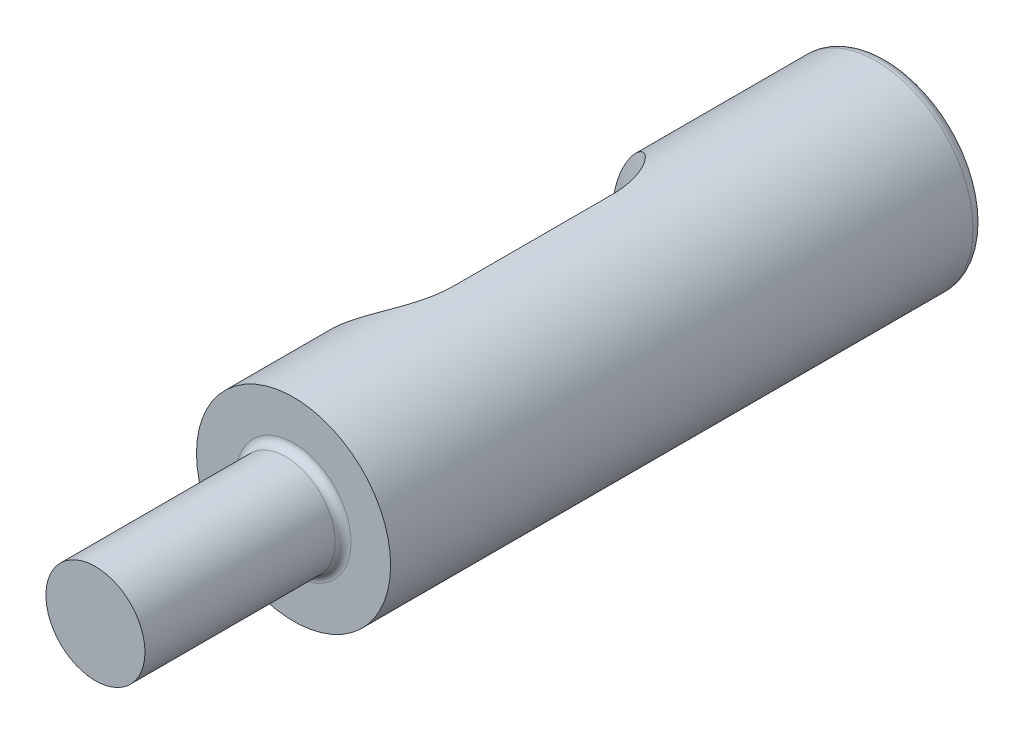
ISO-10303-21;
HEADER;
FILE_DESCRIPTION(('STEP AP214'),'2;1');
FILE_NAME('part.step','',(''),(''),'','','');
FILE_SCHEMA(('AUTOMOTIVE_DESIGN { 1 0 10303 214 1 1 1 1 }'));
ENDSEC;
DATA;
#1=APPLICATION_CONTEXT('core data for automotive mechanical design processes');
#2=APPLICATION_PROTOCOL_DEFINITION('international standard','automotive_design',2000,#1);
#3=PRODUCT_CONTEXT('',#1,'mechanical');
#4=PRODUCT('Part','Part','',(#3));
#5=PRODUCT_RELATED_PRODUCT_CATEGORY('part','',(#4));
#6=PRODUCT_DEFINITION_FORMATION('','',#4);
#7=PRODUCT_DEFINITION_CONTEXT('part definition',#1,'design');
#8=PRODUCT_DEFINITION('design','',#6,#7);
#9=PRODUCT_DEFINITION_SHAPE('','',#8);
#10=(LENGTH_UNIT() NAMED_UNIT(*) SI_UNIT(.MILLI.,.METRE.));
#11=(NAMED_UNIT(*) PLANE_ANGLE_UNIT() SI_UNIT($,.RADIAN.));
#12=(NAMED_UNIT(*) SI_UNIT($,.STERADIAN.) SOLID_ANGLE_UNIT());
#13=UNCERTAINTY_MEASURE_WITH_UNIT(LENGTH_MEASURE(1.E-05),#10,'distance_accuracy_value','');
#14=(GEOMETRIC_REPRESENTATION_CONTEXT(3) GLOBAL_UNCERTAINTY_ASSIGNED_CONTEXT((#13)) GLOBAL_UNIT_ASSIGNED_CONTEXT((#10,
#11,#12)) REPRESENTATION_CONTEXT('',''));
#15=CARTESIAN_POINT('',(0.,0.,0.));
#16=DIRECTION('',(0.,0.,1.));
#17=DIRECTION('',(1.,0.,0.));
#18=AXIS2_PLACEMENT_3D('',#15,#16,#17);
#19=CARTESIAN_POINT('',(0.,0.,15.));
#20=DIRECTION('',(0.,0.,-1.));
#21=DIRECTION('',(-1.,0.,0.));
#22=AXIS2_PLACEMENT_3D('',#19,#20,#21);
#23=CYLINDRICAL_SURFACE('',#22,2.45);
#24=CARTESIAN_POINT('',(0.,0.,0.3));
#25=DIRECTION('',(0.,0.,1.));
#26=DIRECTION('',(1.,0.,0.));
#27=AXIS2_PLACEMENT_3D('',#24,#25,#26);
#28=CIRCLE('',#27,2.45);
#29=CARTESIAN_POINT('',(2.45,0.,0.3));
#30=VERTEX_POINT('',#29);
#31=EDGE_CURVE('E89',#30,#30,#28,.T.);
#32=ORIENTED_EDGE('',*,*,#31,.T.);
#33=EDGE_LOOP('',(#32));
#34=FACE_BOUND('',#33,.T.);
#35=DIRECTION('',(0.,0.,-1.));
#36=VECTOR('',#35,1.);
#37=CARTESIAN_POINT('',(-0.450000000000001,-2.40831891575846,15.));
#38=LINE('',#37,#36);
#39=CARTESIAN_POINT('',(-0.450000000000001,-2.40831891575846,10.5));
#40=VERTEX_POINT('',#39);
#41=CARTESIAN_POINT('',(-0.450000000000001,-2.40831891575846,6.5));
#42=VERTEX_POINT('',#41);
#43=EDGE_CURVE('E68',#40,#42,#38,.T.);
#44=ORIENTED_EDGE('',*,*,#43,.T.);
#45=CARTESIAN_POINT('',(-0.45,-2.40831891575846,6.5));
#46=CARTESIAN_POINT('',(-0.449994588638644,-2.40830673990182,6.44576312548334));
#47=CARTESIAN_POINT('',(-0.452206245268192,-2.4079063220936,6.39152773474038));
#48=CARTESIAN_POINT('',(-0.461022623952719,-2.40624085456906,6.28342465332292));
#49=CARTESIAN_POINT('',(-0.467627668315555,-2.40497574141675,6.22955698991857));
#50=CARTESIAN_POINT('',(-0.485205113353329,-2.4014896622942,6.1224685058545));
#51=CARTESIAN_POINT('',(-0.496185139622994,-2.39926702681005,6.06924898270644));
#52=CARTESIAN_POINT('',(-0.522411179042363,-2.39369255367939,5.96394935087511));
#53=CARTESIAN_POINT('',(-0.537657047458412,-2.39034075434294,5.91186920359915));
#54=CARTESIAN_POINT('',(-0.589676891075349,-2.37825032883879,5.75775371753407));
#55=CARTESIAN_POINT('',(-0.63272426843513,-2.36747797430707,5.65789673021974));
#56=CARTESIAN_POINT('',(-0.733760945904154,-2.33812700415293,5.46746376614885));
#57=CARTESIAN_POINT('',(-0.791732418586446,-2.31955768572881,5.37687689506566));
#58=CARTESIAN_POINT('',(-0.917450163232201,-2.27268604684569,5.21092489353521));
#59=CARTESIAN_POINT('',(-0.984758767234141,-2.24476661182929,5.13512261585109));
#60=CARTESIAN_POINT('',(-1.12677450492275,-2.1769329800425,4.99704661491339));
#61=CARTESIAN_POINT('',(-1.20147705227831,-2.13702618793932,4.93476458091471));
#62=CARTESIAN_POINT('',(-1.34735454603354,-2.04788817506974,4.82917926909461));
#63=CARTESIAN_POINT('',(-1.41833562359118,-1.99965454083784,4.78475846452458));
#64=CARTESIAN_POINT('',(-1.55856870579026,-1.89239384178598,4.70786316333547));
#65=CARTESIAN_POINT('',(-1.62782035056384,-1.83336455148134,4.67539113407729));
#66=CARTESIAN_POINT('',(-1.76215318853848,-1.70472549555496,4.62058113249996));
#67=CARTESIAN_POINT('',(-1.82716389941972,-1.63498134121712,4.59838872569483));
#68=CARTESIAN_POINT('',(-1.949459862911,-1.48705532942486,4.56259762018655));
#69=CARTESIAN_POINT('',(-2.00674134436046,-1.40886938639542,4.54900310463071));
#70=CARTESIAN_POINT('',(-2.11980325298674,-1.23344802850569,4.52647987659713));
#71=CARTESIAN_POINT('',(-2.17407266027131,-1.13511367748442,4.51855552025091));
#72=CARTESIAN_POINT('',(-2.26872434578966,-0.931660324411916,4.50765970477704));
#73=CARTESIAN_POINT('',(-2.30909718120948,-0.826536766429594,4.50469160820744));
#74=CARTESIAN_POINT('',(-2.36124234307436,-0.656743516125686,4.50188094000956));
#75=CARTESIAN_POINT('',(-2.37791431743643,-0.593543316171441,4.50125033937441));
#76=CARTESIAN_POINT('',(-2.40615688679643,-0.466014475964106,4.50042994937348));
#77=CARTESIAN_POINT('',(-2.41772867822465,-0.401686104049764,4.50024005657928));
#78=CARTESIAN_POINT('',(-2.43569945761391,-0.272283726408916,4.50003106998745));
#79=CARTESIAN_POINT('',(-2.44209608193317,-0.207209393726581,4.50001205419403));
#80=CARTESIAN_POINT('',(-2.44966746519406,-0.076778985649605,4.49999642568401));
#81=CARTESIAN_POINT('',(-2.45084392585907,-0.0114230090235922,4.49999980566571));
#82=CARTESIAN_POINT('',(-2.44789577303633,0.122603398217185,4.5000003846436));
#83=CARTESIAN_POINT('',(-2.44348976100511,0.19126779861946,4.49999725000327));
#84=CARTESIAN_POINT('',(-2.42891988046143,0.327985786613469,4.50009790460084));
#85=CARTESIAN_POINT('',(-2.41875570598017,0.396039341551772,4.50020169952083));
#86=CARTESIAN_POINT('',(-2.39273502899384,0.531083578166653,4.50077765617357));
#87=CARTESIAN_POINT('',(-2.37687571208978,0.598073717207834,4.50125000016977));
#88=CARTESIAN_POINT('',(-2.33957154891383,0.730506440396349,4.50296367021533));
#89=CARTESIAN_POINT('',(-2.31812403873948,0.795948270188171,4.504205363405));
#90=CARTESIAN_POINT('',(-2.26979020110749,0.924819851906864,4.50798791132727));
#91=CARTESIAN_POINT('',(-2.2428993195288,0.988247867258108,4.51052985663496));
#92=CARTESIAN_POINT('',(-2.18392196405104,1.1125265907134,4.51755600733056));
#93=CARTESIAN_POINT('',(-2.15183599892548,1.17337755046246,4.52204002259641));
#94=CARTESIAN_POINT('',(-2.08282786305046,1.29190579948356,4.53368211834222));
#95=CARTESIAN_POINT('',(-2.04591245945963,1.34958737211854,4.54083648256819));
#96=CARTESIAN_POINT('',(-1.96768828241532,1.46128599403185,4.55861274135592));
#97=CARTESIAN_POINT('',(-1.92638111511628,1.51530437125597,4.56923337115718));
#98=CARTESIAN_POINT('',(-1.81881968401488,1.64452697674732,4.6010252972687));
#99=CARTESIAN_POINT('',(-1.75022867654072,1.71720495714494,4.62481608420215));
#100=CARTESIAN_POINT('',(-1.60762382396598,1.85138392247269,4.68441419536105));
#101=CARTESIAN_POINT('',(-1.53361551293107,1.91289609630418,4.72020938675206));
#102=CARTESIAN_POINT('',(-1.38386896929108,2.02388996106238,4.80565299161913));
#103=CARTESIAN_POINT('',(-1.30812440080229,2.07331567680056,4.85536365648865));
#104=CARTESIAN_POINT('',(-1.1600344295933,2.15967286454585,4.9687666163425));
#105=CARTESIAN_POINT('',(-1.08768931032844,2.19660329624841,5.03246007474759));
#106=CARTESIAN_POINT('',(-0.955924709780423,2.25689744511659,5.16734198243619));
#107=CARTESIAN_POINT('',(-0.89594591711626,2.28105917616675,5.23763469973116));
#108=CARTESIAN_POINT('',(-0.785462095537206,2.32142570760885,5.3873567483365));
#109=CARTESIAN_POINT('',(-0.734960197119518,2.33762788157415,5.46678908480378));
#110=CARTESIAN_POINT('',(-0.64319011108965,2.36457455526543,5.63674156027941));
#111=CARTESIAN_POINT('',(-0.602484102874423,2.37501845982701,5.72761153903245));
#112=CARTESIAN_POINT('',(-0.534958418315524,2.39113559866541,5.91475772347202));
#113=CARTESIAN_POINT('',(-0.508136461801864,2.39680961639362,6.0110330385626));
#114=CARTESIAN_POINT('',(-0.475789148637746,2.40339230995952,6.17317930955462));
#115=CARTESIAN_POINT('',(-0.466120109198568,2.40526631403476,6.23821815228647));
#116=CARTESIAN_POINT('',(-0.45322792760705,2.40771605705514,6.36883154241866));
#117=CARTESIAN_POINT('',(-0.449992597637919,2.40829425100674,6.43440484017941));
#118=CARTESIAN_POINT('',(-0.45,2.40831891575846,6.5));
#119=B_SPLINE_CURVE_WITH_KNOTS('',3,(#45,#46,#47,#48,#49,#50,#51,#52,#53,#54,#55,#56,#57,#58,
#59,#60,#61,#62,#63,#64,#65,#66,#67,#68,#69,#70,#71,#72,#73,#74,#75,#76,#77,#78,#79,#80,#81,#82,
#83,#84,#85,#86,#87,#88,#89,#90,#91,#92,#93,#94,#95,#96,#97,#98,#99,#100,#101,#102,#103,#104,
#105,#106,#107,#108,#109,#110,#111,#112,#113,#114,#115,#116,#117,#118),.UNSPECIFIED.,.F.,.F.,(4,
2,2,2,2,2,2,2,2,2,2,2,2,2,2,2,2,2,2,2,2,2,2,2,2,2,2,2,2,2,2,2,2,2,2,2,4),(0.,0.162661127417037,
0.32533418930149,0.488292039476625,0.651244361405537,0.97730937274322,1.30298667926192,
1.61669186460785,1.93020366934838,2.21870983734064,2.50727554699138,2.79981120681034,
3.09248908525521,3.42902207777651,3.76578329736792,3.96169601111715,4.15756274204083,
4.35351888029015,4.5494111340192,4.75558229731805,4.96176441686591,5.16804856706681,
5.3744312338066,5.58098728673507,5.78752312309691,5.99377259424879,6.19994689369567,
6.50673942077732,6.81322280291548,7.12109978460593,7.42900239252902,7.71426024038907,
7.99961215207868,8.29871370567918,8.597766122403,8.79479918661163,8.99145864065558),.UNSPECIFIED.);
#120=CARTESIAN_POINT('',(-0.450000000000001,2.40831891575846,6.5));
#121=VERTEX_POINT('',#120);
#122=EDGE_CURVE('E74',#42,#121,#119,.T.);
#123=ORIENTED_EDGE('',*,*,#122,.T.);
#124=DIRECTION('',(0.,0.,-1.));
#125=VECTOR('',#124,1.);
#126=CARTESIAN_POINT('',(-0.450000000000001,2.40831891575846,15.));
#127=LINE('',#126,#125);
#128=CARTESIAN_POINT('',(-0.450000000000001,2.40831891575846,10.5));
#129=VERTEX_POINT('',#128);
#130=EDGE_CURVE('E54',#121,#129,#127,.F.);
#131=ORIENTED_EDGE('',*,*,#130,.T.);
#132=CARTESIAN_POINT('',(-0.450000000000001,2.40831891575846,10.5));
#133=CARTESIAN_POINT('',(-0.449994588638644,2.40830673990182,10.5542368745167));
#134=CARTESIAN_POINT('',(-0.452206245268193,2.4079063220936,10.6084722652596));
#135=CARTESIAN_POINT('',(-0.461022623952719,2.40624085456906,10.7165753466771));
#136=CARTESIAN_POINT('',(-0.467627668315556,2.40497574141675,10.7704430100814));
#137=CARTESIAN_POINT('',(-0.485205113353329,2.4014896622942,10.8775314941455));
#138=CARTESIAN_POINT('',(-0.496185139622995,2.39926702681005,10.9307510172936));
#139=CARTESIAN_POINT('',(-0.522411179042364,2.39369255367939,11.0360506491249));
#140=CARTESIAN_POINT('',(-0.537657047458413,2.39034075434294,11.0881307964009));
#141=CARTESIAN_POINT('',(-0.58967689107535,2.37825032883879,11.2422462824659));
#142=CARTESIAN_POINT('',(-0.632724268435131,2.36747797430707,11.3421032697803));
#143=CARTESIAN_POINT('',(-0.733760945904155,2.33812700415293,11.5325362338512));
#144=CARTESIAN_POINT('',(-0.791732418586447,2.31955768572881,11.6231231049343));
#145=CARTESIAN_POINT('',(-0.917450163232202,2.27268604684569,11.7890751064648));
#146=CARTESIAN_POINT('',(-0.984758767234142,2.24476661182929,11.8648773841489));
#147=CARTESIAN_POINT('',(-1.12677450492275,2.1769329800425,12.0029533850866));
#148=CARTESIAN_POINT('',(-1.20147705227831,2.13702618793932,12.0652354190853));
#149=CARTESIAN_POINT('',(-1.34735454603354,2.04788817506973,12.1708207309054));
#150=CARTESIAN_POINT('',(-1.41833562359119,1.99965454083784,12.2152415354754));
#151=CARTESIAN_POINT('',(-1.55856870579026,1.89239384178598,12.2921368366645));
#152=CARTESIAN_POINT('',(-1.62782035056384,1.83336455148134,12.3246088659227));
#153=CARTESIAN_POINT('',(-1.76215318853848,1.70472549555496,12.3794188675));
#154=CARTESIAN_POINT('',(-1.82716389941972,1.63498134121712,12.4016112743052));
#155=CARTESIAN_POINT('',(-1.949459862911,1.48705532942485,12.4374023798135));
#156=CARTESIAN_POINT('',(-2.00674134436046,1.40886938639542,12.4509968953693));
#157=CARTESIAN_POINT('',(-2.11980325298674,1.23344802850569,12.4735201234029));
#158=CARTESIAN_POINT('',(-2.17407266027131,1.13511367748442,12.4814444797491));
#159=CARTESIAN_POINT('',(-2.26872434578966,0.931660324411912,12.492340295223));
#160=CARTESIAN_POINT('',(-2.30909718120948,0.826536766429591,12.4953083917926));
#161=CARTESIAN_POINT('',(-2.36124234307436,0.656743516125682,12.4981190599904));
#162=CARTESIAN_POINT('',(-2.37791431743643,0.593543316171436,12.4987496606256));
#163=CARTESIAN_POINT('',(-2.40615688679643,0.466014475964102,12.4995700506265));
#164=CARTESIAN_POINT('',(-2.41772867822465,0.40168610404976,12.4997599434207));
#165=CARTESIAN_POINT('',(-2.43569945761391,0.272283726408912,12.4999689300125));
#166=CARTESIAN_POINT('',(-2.44209608193317,0.207209393726577,12.499987945806));
#167=CARTESIAN_POINT('',(-2.44966746519406,0.0767789856496012,12.500003574316));
#168=CARTESIAN_POINT('',(-2.45084392585907,0.0114230090235885,12.5000001943343));
#169=CARTESIAN_POINT('',(-2.44789577303633,-0.122603398217189,12.4999996153564));
#170=CARTESIAN_POINT('',(-2.44348976100511,-0.191267798619464,12.5000027499967));
#171=CARTESIAN_POINT('',(-2.42891988046143,-0.327985786613472,12.4999020953992));
#172=CARTESIAN_POINT('',(-2.41875570598017,-0.396039341551775,12.4997983004792));
#173=CARTESIAN_POINT('',(-2.39273502899384,-0.531083578166656,12.4992223438264));
#174=CARTESIAN_POINT('',(-2.37687571208978,-0.598073717207837,12.4987499998302));
#175=CARTESIAN_POINT('',(-2.33957154891383,-0.730506440396352,12.4970363297847));
#176=CARTESIAN_POINT('',(-2.31812403873948,-0.795948270188175,12.495794636595));
#177=CARTESIAN_POINT('',(-2.26979020110749,-0.924819851906868,12.4920120886727));
#178=CARTESIAN_POINT('',(-2.24289931952879,-0.988247867258111,12.489470143365));
#179=CARTESIAN_POINT('',(-2.18392196405104,-1.1125265907134,12.4824439926694));
#180=CARTESIAN_POINT('',(-2.15183599892548,-1.17337755046246,12.4779599774036));
#181=CARTESIAN_POINT('',(-2.08282786305046,-1.29190579948357,12.4663178816578));
#182=CARTESIAN_POINT('',(-2.04591245945963,-1.34958737211854,12.4591635174318));
#183=CARTESIAN_POINT('',(-1.96768828241532,-1.46128599403185,12.4413872586441));
#184=CARTESIAN_POINT('',(-1.92638111511628,-1.51530437125597,12.4307666288428));
#185=CARTESIAN_POINT('',(-1.81881968401488,-1.64452697674733,12.3989747027313));
#186=CARTESIAN_POINT('',(-1.75022867654071,-1.71720495714494,12.3751839157979));
#187=CARTESIAN_POINT('',(-1.60762382396598,-1.8513839224727,12.315585804639));
#188=CARTESIAN_POINT('',(-1.53361551293107,-1.91289609630419,12.2797906132479));
#189=CARTESIAN_POINT('',(-1.38386896929108,-2.02388996106238,12.1943470083809));
#190=CARTESIAN_POINT('',(-1.30812440080229,-2.07331567680057,12.1446363435113));
#191=CARTESIAN_POINT('',(-1.1600344295933,-2.15967286454585,12.0312333836575));
#192=CARTESIAN_POINT('',(-1.08768931032844,-2.19660329624841,11.9675399252524));
#193=CARTESIAN_POINT('',(-0.955924709780422,-2.25689744511659,11.8326580175638));
#194=CARTESIAN_POINT('',(-0.895945917116258,-2.28105917616675,11.7623653002688));
#195=CARTESIAN_POINT('',(-0.785462095537205,-2.32142570760885,11.6126432516635));
#196=CARTESIAN_POINT('',(-0.734960197119517,-2.33762788157415,11.5332109151962));
#197=CARTESIAN_POINT('',(-0.64319011108965,-2.36457455526543,11.3632584397206));
#198=CARTESIAN_POINT('',(-0.602484102874423,-2.37501845982701,11.2723884609676));
#199=CARTESIAN_POINT('',(-0.534958418315525,-2.39113559866541,11.085242276528));
#200=CARTESIAN_POINT('',(-0.508136461801864,-2.39680961639362,10.9889669614374));
#201=CARTESIAN_POINT('',(-0.475789148637746,-2.40339230995952,10.8268206904454));
#202=CARTESIAN_POINT('',(-0.466120109198568,-2.40526631403476,10.7617818477135));
#203=CARTESIAN_POINT('',(-0.453227927607051,-2.40771605705514,10.6311684575813));
#204=CARTESIAN_POINT('',(-0.449992597637919,-2.40829425100674,10.5655951598206));
#205=CARTESIAN_POINT('',(-0.450000000000001,-2.40831891575846,10.5));
#206=B_SPLINE_CURVE_WITH_KNOTS('',3,(#132,#133,#134,#135,#136,#137,#138,#139,#140,#141,#142,
#143,#144,#145,#146,#147,#148,#149,#150,#151,#152,#153,#154,#155,#156,#157,#158,#159,#160,#161,
#162,#163,#164,#165,#166,#167,#168,#169,#170,#171,#172,#173,#174,#175,#176,#177,#178,#179,#180,
#181,#182,#183,#184,#185,#186,#187,#188,#189,#190,#191,#192,#193,#194,#195,#196,#197,#198,#199,
#200,#201,#202,#203,#204,#205),.UNSPECIFIED.,.F.,.F.,(4,2,2,2,2,2,2,2,2,2,2,2,2,2,2,2,2,2,2,2,2,
2,2,2,2,2,2,2,2,2,2,2,2,2,2,2,4),(0.,0.162661127417037,0.325334189301491,0.488292039476626,
0.651244361405538,0.977309372743222,1.30298667926192,1.61669186460785,1.93020366934839,
2.21870983734064,2.50727554699138,2.79981120681035,3.09248908525522,3.42902207777651,
3.76578329736792,3.96169601111715,4.15756274204083,4.35351888029016,4.5494111340192,
4.75558229731806,4.96176441686591,5.16804856706681,5.37443123380661,5.58098728673507,
5.78752312309692,5.99377259424879,6.19994689369568,6.50673942077732,6.81322280291548,
7.12109978460594,7.42900239252903,7.71426024038908,7.99961215207868,8.29871370567918,
8.597766122403,8.79479918661163,8.99145864065557),.UNSPECIFIED.);
#207=EDGE_CURVE('E61',#129,#40,#206,.T.);
#208=ORIENTED_EDGE('',*,*,#207,.T.);
#209=EDGE_LOOP('',(#44,#123,#131,#208));
#210=FACE_BOUND('',#209,.T.);
#211=CARTESIAN_POINT('',(0.,0.,15.));
#212=DIRECTION('',(0.,0.,1.));
#213=DIRECTION('',(1.,0.,0.));
#214=AXIS2_PLACEMENT_3D('',#211,#212,#213);
#215=CIRCLE('',#214,2.45);
#216=CARTESIAN_POINT('',(2.45,0.,15.));
#217=VERTEX_POINT('',#216);
#218=EDGE_CURVE('E65',#217,#217,#215,.T.);
#219=ORIENTED_EDGE('',*,*,#218,.F.);
#220=EDGE_LOOP('',(#219));
#221=FACE_BOUND('',#220,.T.);
#222=ADVANCED_FACE('F33',(#34,#210,#221),#23,.T.);
#223=CARTESIAN_POINT('',(0.,0.,15.));
#224=DIRECTION('',(0.,0.,1.));
#225=DIRECTION('',(1.,0.,0.));
#226=AXIS2_PLACEMENT_3D('',#223,#224,#225);
#227=PLANE('',#226);
#228=CARTESIAN_POINT('',(0.,0.,15.));
#229=DIRECTION('',(0.,0.,1.));
#230=DIRECTION('',(1.,0.,0.));
#231=AXIS2_PLACEMENT_3D('',#228,#229,#230);
#232=CIRCLE('',#231,1.45);
#233=CARTESIAN_POINT('',(1.45,0.,15.));
#234=VERTEX_POINT('',#233);
#235=EDGE_CURVE('E11',#234,#234,#232,.F.);
#236=ORIENTED_EDGE('',*,*,#235,.T.);
#237=EDGE_LOOP('',(#236));
#238=FACE_BOUND('',#237,.T.);
#239=ORIENTED_EDGE('',*,*,#218,.T.);
#240=EDGE_LOOP('',(#239));
#241=FACE_BOUND('',#240,.T.);
#242=ADVANCED_FACE('F101',(#238,#241),#227,.T.);
#243=CARTESIAN_POINT('',(0.,0.,0.));
#244=DIRECTION('',(0.,0.,1.));
#245=DIRECTION('',(1.,0.,0.));
#246=AXIS2_PLACEMENT_3D('',#243,#244,#245);
#247=PLANE('',#246);
#248=CARTESIAN_POINT('',(0.,0.,0.));
#249=DIRECTION('',(0.,0.,1.));
#250=DIRECTION('',(1.,0.,0.));
#251=AXIS2_PLACEMENT_3D('',#248,#249,#250);
#252=CIRCLE('',#251,2.15);
#253=CARTESIAN_POINT('',(2.15,0.,0.));
#254=VERTEX_POINT('',#253);
#255=EDGE_CURVE('E116',#254,#254,#252,.F.);
#256=ORIENTED_EDGE('',*,*,#255,.T.);
#257=EDGE_LOOP('',(#256));
#258=FACE_BOUND('',#257,.T.);
#259=ADVANCED_FACE('F97',(#258),#247,.F.);
#260=CARTESIAN_POINT('',(-2.45,-2.45,6.5));
#261=DIRECTION('',(0.,1.,0.));
#262=DIRECTION('',(0.,0.,1.));
#263=AXIS2_PLACEMENT_3D('',#260,#261,#262);
#264=CYLINDRICAL_SURFACE('',#263,2.);
#265=DIRECTION('',(0.,1.,0.));
#266=VECTOR('',#265,1.);
#267=CARTESIAN_POINT('',(-0.450000000000001,-2.45,6.5));
#268=LINE('',#267,#266);
#269=EDGE_CURVE('E69',#42,#121,#268,.T.);
#270=ORIENTED_EDGE('',*,*,#269,.T.);
#271=ORIENTED_EDGE('',*,*,#122,.F.);
#272=EDGE_LOOP('',(#270,#271));
#273=FACE_BOUND('',#272,.T.);
#274=ADVANCED_FACE('F93',(#273),#264,.F.);
#275=CARTESIAN_POINT('',(-0.450000000000001,-2.45,6.5));
#276=DIRECTION('',(1.,0.,0.));
#277=DIRECTION('',(0.,0.,-1.));
#278=AXIS2_PLACEMENT_3D('',#275,#276,#277);
#279=PLANE('',#278);
#280=DIRECTION('',(0.,1.,0.));
#281=VECTOR('',#280,1.);
#282=CARTESIAN_POINT('',(-0.450000000000001,-2.45,10.5));
#283=LINE('',#282,#281);
#284=EDGE_CURVE('E47',#40,#129,#283,.T.);
#285=ORIENTED_EDGE('',*,*,#284,.T.);
#286=ORIENTED_EDGE('',*,*,#130,.F.);
#287=ORIENTED_EDGE('',*,*,#269,.F.);
#288=ORIENTED_EDGE('',*,*,#43,.F.);
#289=EDGE_LOOP('',(#285,#286,#287,#288));
#290=FACE_BOUND('',#289,.T.);
#291=ADVANCED_FACE('F67',(#290),#279,.F.);
#292=CARTESIAN_POINT('',(-2.45,-2.45,10.5));
#293=DIRECTION('',(0.,1.,0.));
#294=DIRECTION('',(0.,0.,1.));
#295=AXIS2_PLACEMENT_3D('',#292,#293,#294);
#296=CYLINDRICAL_SURFACE('',#295,2.);
#297=ORIENTED_EDGE('',*,*,#284,.F.);
#298=ORIENTED_EDGE('',*,*,#207,.F.);
#299=EDGE_LOOP('',(#297,#298));
#300=FACE_BOUND('',#299,.T.);
#301=ADVANCED_FACE('F62',(#300),#296,.F.);
#302=CARTESIAN_POINT('',(0.,0.,20.));
#303=DIRECTION('',(0.,0.,-1.));
#304=DIRECTION('',(-1.,0.,0.));
#305=AXIS2_PLACEMENT_3D('',#302,#303,#304);
#306=CYLINDRICAL_SURFACE('',#305,1.25);
#307=CARTESIAN_POINT('',(0.,0.,15.2));
#308=DIRECTION('',(0.,0.,1.));
#309=DIRECTION('',(1.,0.,0.));
#310=AXIS2_PLACEMENT_3D('',#307,#308,#309);
#311=CIRCLE('',#310,1.25);
#312=CARTESIAN_POINT('',(1.25,0.,15.2));
#313=VERTEX_POINT('',#312);
#314=EDGE_CURVE('E41',#313,#313,#311,.T.);
#315=ORIENTED_EDGE('',*,*,#314,.T.);
#316=EDGE_LOOP('',(#315));
#317=FACE_BOUND('',#316,.T.);
#318=CARTESIAN_POINT('',(0.,0.,20.));
#319=DIRECTION('',(0.,0.,1.));
#320=DIRECTION('',(1.,0.,0.));
#321=AXIS2_PLACEMENT_3D('',#318,#319,#320);
#322=CIRCLE('',#321,1.25);
#323=CARTESIAN_POINT('',(1.25,0.,20.));
#324=VERTEX_POINT('',#323);
#325=EDGE_CURVE('E70',#324,#324,#322,.T.);
#326=ORIENTED_EDGE('',*,*,#325,.F.);
#327=EDGE_LOOP('',(#326));
#328=FACE_BOUND('',#327,.T.);
#329=ADVANCED_FACE('F121',(#317,#328),#306,.T.);
#330=CARTESIAN_POINT('',(0.,0.,20.));
#331=DIRECTION('',(0.,0.,1.));
#332=DIRECTION('',(1.,0.,0.));
#333=AXIS2_PLACEMENT_3D('',#330,#331,#332);
#334=PLANE('',#333);
#335=ORIENTED_EDGE('',*,*,#325,.T.);
#336=EDGE_LOOP('',(#335));
#337=FACE_BOUND('',#336,.T.);
#338=ADVANCED_FACE('F130',(#337),#334,.T.);
#339=CARTESIAN_POINT('',(0.,0.,0.3));
#340=DIRECTION('',(0.,0.,1.));
#341=DIRECTION('',(1.,0.,0.));
#342=AXIS2_PLACEMENT_3D('',#339,#340,#341);
#343=TOROIDAL_SURFACE('',#342,2.15,0.3);
#344=ORIENTED_EDGE('',*,*,#255,.F.);
#345=EDGE_LOOP('',(#344));
#346=FACE_BOUND('',#345,.T.);
#347=ORIENTED_EDGE('',*,*,#31,.F.);
#348=EDGE_LOOP('',(#347));
#349=FACE_BOUND('',#348,.T.);
#350=ADVANCED_FACE('F125',(#346,#349),#343,.T.);
#351=CARTESIAN_POINT('',(0.,0.,15.2));
#352=DIRECTION('',(0.,0.,1.));
#353=DIRECTION('',(1.,0.,0.));
#354=AXIS2_PLACEMENT_3D('',#351,#352,#353);
#355=TOROIDAL_SURFACE('',#354,1.45,0.2);
#356=ORIENTED_EDGE('',*,*,#235,.F.);
#357=EDGE_LOOP('',(#356));
#358=FACE_BOUND('',#357,.T.);
#359=ORIENTED_EDGE('',*,*,#314,.F.);
#360=EDGE_LOOP('',(#359));
#361=FACE_BOUND('',#360,.T.);
#362=ADVANCED_FACE('F35',(#358,#361),#355,.F.);
#363=CLOSED_SHELL('',(#222,#242,#259,#274,#291,#301,#329,#338,#350,#362));
#364=MANIFOLD_SOLID_BREP('B2',#363);
#365=ADVANCED_BREP_SHAPE_REPRESENTATION('',(#18,#364),#14);
#366=SHAPE_DEFINITION_REPRESENTATION(#9,#365);
ENDSEC;
END-ISO-10303-21;
